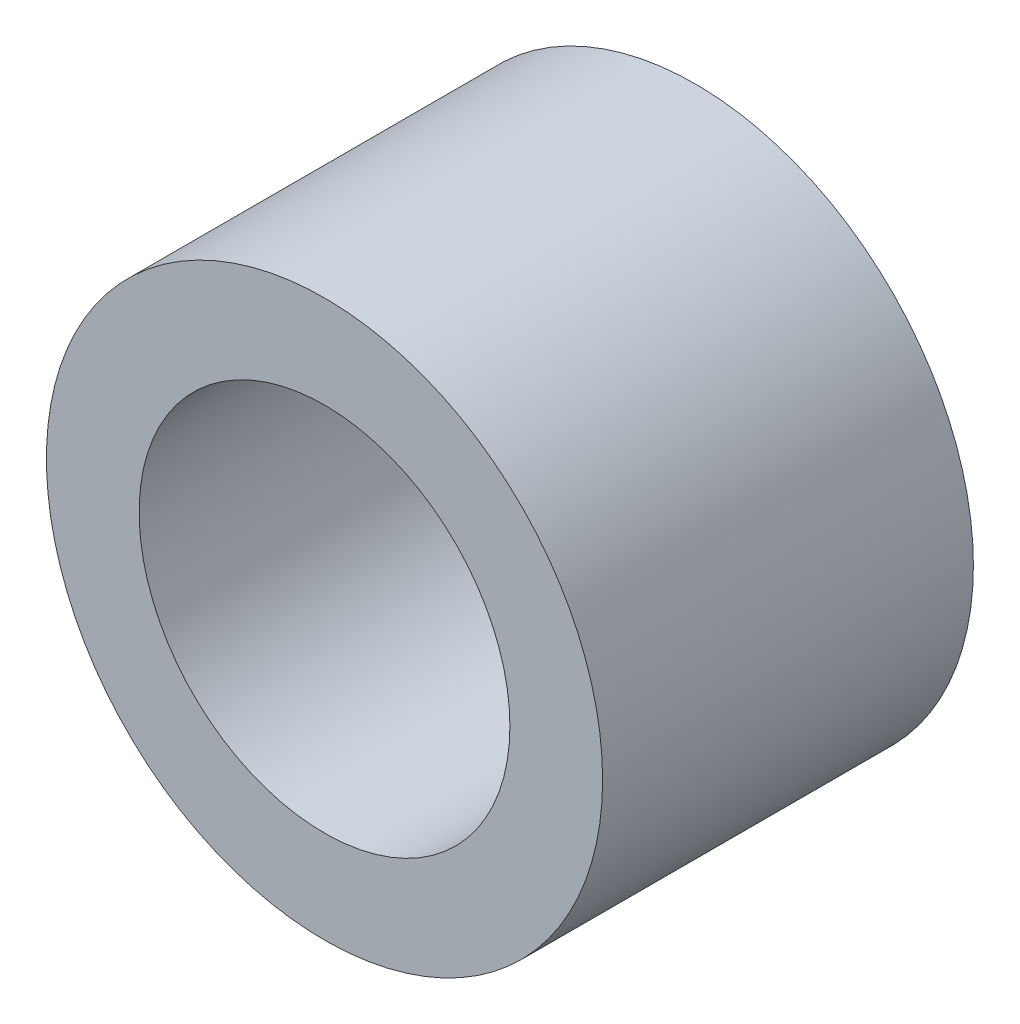
ISO-10303-21;
HEADER;
FILE_DESCRIPTION(('STEP AP214'),'2;1');
FILE_NAME('part.step','',(''),(''),'','','');
FILE_SCHEMA(('AUTOMOTIVE_DESIGN { 1 0 10303 214 1 1 1 1 }'));
ENDSEC;
DATA;
#1=APPLICATION_CONTEXT('core data for automotive mechanical design processes');
#2=APPLICATION_PROTOCOL_DEFINITION('international standard','automotive_design',2000,#1);
#3=PRODUCT_CONTEXT('',#1,'mechanical');
#4=PRODUCT('Part','Part','',(#3));
#5=PRODUCT_RELATED_PRODUCT_CATEGORY('part','',(#4));
#6=PRODUCT_DEFINITION_FORMATION('','',#4);
#7=PRODUCT_DEFINITION_CONTEXT('part definition',#1,'design');
#8=PRODUCT_DEFINITION('design','',#6,#7);
#9=PRODUCT_DEFINITION_SHAPE('','',#8);
#10=(LENGTH_UNIT() NAMED_UNIT(*) SI_UNIT(.MILLI.,.METRE.));
#11=(NAMED_UNIT(*) PLANE_ANGLE_UNIT() SI_UNIT($,.RADIAN.));
#12=(NAMED_UNIT(*) SI_UNIT($,.STERADIAN.) SOLID_ANGLE_UNIT());
#13=UNCERTAINTY_MEASURE_WITH_UNIT(LENGTH_MEASURE(1.E-05),#10,'distance_accuracy_value','');
#14=(GEOMETRIC_REPRESENTATION_CONTEXT(3) GLOBAL_UNCERTAINTY_ASSIGNED_CONTEXT((#13)) GLOBAL_UNIT_ASSIGNED_CONTEXT((#10,
#11,#12)) REPRESENTATION_CONTEXT('',''));
#15=CARTESIAN_POINT('',(0.,0.,0.));
#16=DIRECTION('',(0.,0.,1.));
#17=DIRECTION('',(1.,0.,0.));
#18=AXIS2_PLACEMENT_3D('',#15,#16,#17);
#19=CARTESIAN_POINT('',(0.,0.,-25.4));
#20=DIRECTION('',(0.,0.,1.));
#21=DIRECTION('',(1.,0.,0.));
#22=AXIS2_PLACEMENT_3D('',#19,#20,#21);
#23=CYLINDRICAL_SURFACE('',#22,38.1);
#24=CARTESIAN_POINT('',(0.,0.,-25.4));
#25=DIRECTION('',(0.,0.,1.));
#26=DIRECTION('',(1.,0.,0.));
#27=AXIS2_PLACEMENT_3D('',#24,#25,#26);
#28=CIRCLE('',#27,38.1);
#29=CARTESIAN_POINT('',(38.1,0.,-25.4));
#30=VERTEX_POINT('',#29);
#31=EDGE_CURVE('E10',#30,#30,#28,.T.);
#32=ORIENTED_EDGE('',*,*,#31,.T.);
#33=EDGE_LOOP('',(#32));
#34=FACE_BOUND('',#33,.T.);
#35=CARTESIAN_POINT('',(0.,0.,25.4));
#36=DIRECTION('',(0.,0.,1.));
#37=DIRECTION('',(1.,0.,0.));
#38=AXIS2_PLACEMENT_3D('',#35,#36,#37);
#39=CIRCLE('',#38,38.1);
#40=CARTESIAN_POINT('',(38.1,0.,25.4));
#41=VERTEX_POINT('',#40);
#42=EDGE_CURVE('E40',#41,#41,#39,.T.);
#43=ORIENTED_EDGE('',*,*,#42,.F.);
#44=EDGE_LOOP('',(#43));
#45=FACE_BOUND('',#44,.T.);
#46=ADVANCED_FACE('F37',(#34,#45),#23,.T.);
#47=CARTESIAN_POINT('',(0.,0.,-25.4));
#48=DIRECTION('',(0.,0.,1.));
#49=DIRECTION('',(1.,0.,0.));
#50=AXIS2_PLACEMENT_3D('',#47,#48,#49);
#51=PLANE('',#50);
#52=CARTESIAN_POINT('',(0.,0.,-25.4));
#53=DIRECTION('',(0.,0.,1.));
#54=DIRECTION('',(1.,0.,0.));
#55=AXIS2_PLACEMENT_3D('',#52,#53,#54);
#56=CIRCLE('',#55,25.4);
#57=CARTESIAN_POINT('',(25.4,0.,-25.4));
#58=VERTEX_POINT('',#57);
#59=EDGE_CURVE('E49',#58,#58,#56,.T.);
#60=ORIENTED_EDGE('',*,*,#59,.T.);
#61=EDGE_LOOP('',(#60));
#62=FACE_BOUND('',#61,.T.);
#63=ORIENTED_EDGE('',*,*,#31,.F.);
#64=EDGE_LOOP('',(#63));
#65=FACE_BOUND('',#64,.T.);
#66=ADVANCED_FACE('F59',(#62,#65),#51,.F.);
#67=CARTESIAN_POINT('',(0.,0.,25.4));
#68=DIRECTION('',(0.,0.,1.));
#69=DIRECTION('',(1.,0.,0.));
#70=AXIS2_PLACEMENT_3D('',#67,#68,#69);
#71=PLANE('',#70);
#72=CARTESIAN_POINT('',(0.,0.,25.4));
#73=DIRECTION('',(0.,0.,1.));
#74=DIRECTION('',(1.,0.,0.));
#75=AXIS2_PLACEMENT_3D('',#72,#73,#74);
#76=CIRCLE('',#75,25.4);
#77=CARTESIAN_POINT('',(25.4,0.,25.4));
#78=VERTEX_POINT('',#77);
#79=EDGE_CURVE('E51',#78,#78,#76,.T.);
#80=ORIENTED_EDGE('',*,*,#79,.F.);
#81=EDGE_LOOP('',(#80));
#82=FACE_BOUND('',#81,.T.);
#83=ORIENTED_EDGE('',*,*,#42,.T.);
#84=EDGE_LOOP('',(#83));
#85=FACE_BOUND('',#84,.T.);
#86=ADVANCED_FACE('F65',(#82,#85),#71,.T.);
#87=CARTESIAN_POINT('',(0.,0.,-25.4));
#88=DIRECTION('',(0.,0.,1.));
#89=DIRECTION('',(1.,0.,0.));
#90=AXIS2_PLACEMENT_3D('',#87,#88,#89);
#91=CYLINDRICAL_SURFACE('',#90,25.4);
#92=ORIENTED_EDGE('',*,*,#59,.F.);
#93=EDGE_LOOP('',(#92));
#94=FACE_BOUND('',#93,.T.);
#95=ORIENTED_EDGE('',*,*,#79,.T.);
#96=EDGE_LOOP('',(#95));
#97=FACE_BOUND('',#96,.T.);
#98=ADVANCED_FACE('F62',(#94,#97),#91,.F.);
#99=CLOSED_SHELL('',(#46,#66,#86,#98));
#100=MANIFOLD_SOLID_BREP('B2',#99);
#101=ADVANCED_BREP_SHAPE_REPRESENTATION('',(#18,#100),#14);
#102=SHAPE_DEFINITION_REPRESENTATION(#9,#101);
ENDSEC;
END-ISO-10303-21;
